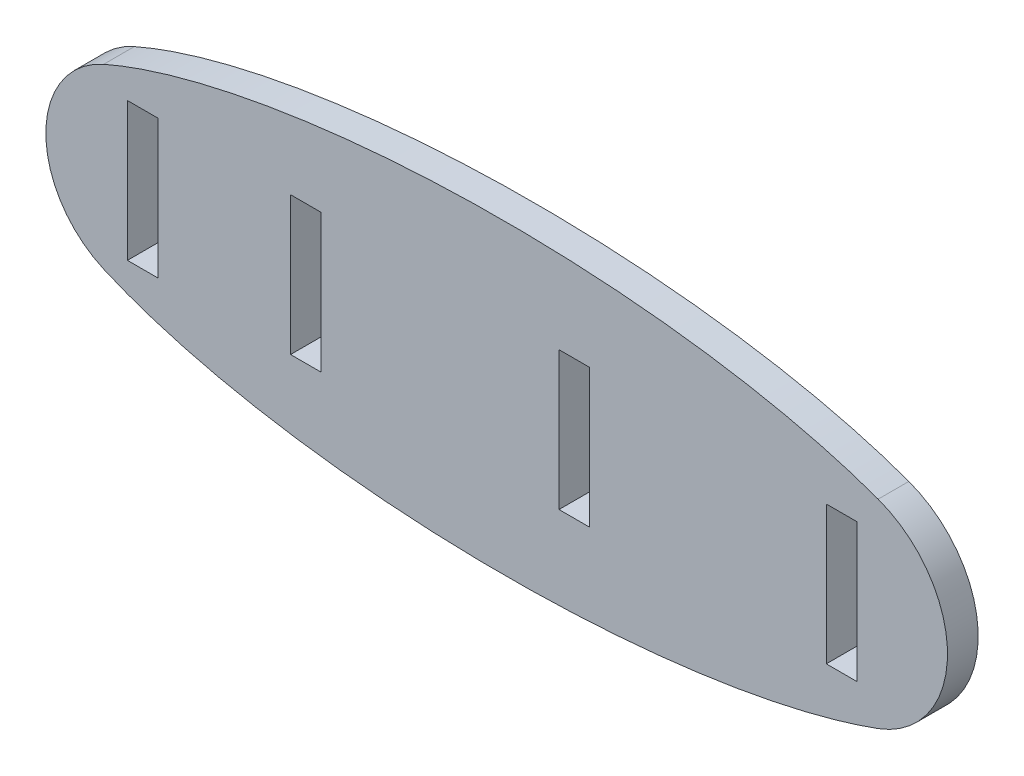
ISO-10303-21;
HEADER;
FILE_DESCRIPTION(('STEP AP214'),'2;1');
FILE_NAME('part.step','',(''),(''),'','','');
FILE_SCHEMA(('AUTOMOTIVE_DESIGN { 1 0 10303 214 1 1 1 1 }'));
ENDSEC;
DATA;
#1=APPLICATION_CONTEXT('core data for automotive mechanical design processes');
#2=APPLICATION_PROTOCOL_DEFINITION('international standard','automotive_design',2000,#1);
#3=PRODUCT_CONTEXT('',#1,'mechanical');
#4=PRODUCT('Part','Part','',(#3));
#5=PRODUCT_RELATED_PRODUCT_CATEGORY('part','',(#4));
#6=PRODUCT_DEFINITION_FORMATION('','',#4);
#7=PRODUCT_DEFINITION_CONTEXT('part definition',#1,'design');
#8=PRODUCT_DEFINITION('design','',#6,#7);
#9=PRODUCT_DEFINITION_SHAPE('','',#8);
#10=(LENGTH_UNIT() NAMED_UNIT(*) SI_UNIT(.MILLI.,.METRE.));
#11=(NAMED_UNIT(*) PLANE_ANGLE_UNIT() SI_UNIT($,.RADIAN.));
#12=(NAMED_UNIT(*) SI_UNIT($,.STERADIAN.) SOLID_ANGLE_UNIT());
#13=UNCERTAINTY_MEASURE_WITH_UNIT(LENGTH_MEASURE(1.E-05),#10,'distance_accuracy_value','');
#14=(GEOMETRIC_REPRESENTATION_CONTEXT(3) GLOBAL_UNCERTAINTY_ASSIGNED_CONTEXT((#13)) GLOBAL_UNIT_ASSIGNED_CONTEXT((#10,
#11,#12)) REPRESENTATION_CONTEXT('',''));
#15=CARTESIAN_POINT('',(0.,0.,0.));
#16=DIRECTION('',(0.,0.,1.));
#17=DIRECTION('',(1.,0.,0.));
#18=AXIS2_PLACEMENT_3D('',#15,#16,#17);
#19=CARTESIAN_POINT('',(18.25625,0.,1.5875));
#20=DIRECTION('',(-1.,0.,0.));
#21=DIRECTION('',(0.,-1.,0.));
#22=AXIS2_PLACEMENT_3D('',#19,#20,#21);
#23=PLANE('',#22);
#24=DIRECTION('',(0.,1.,0.));
#25=VECTOR('',#24,1.);
#26=CARTESIAN_POINT('',(18.25625,0.,0.));
#27=LINE('',#26,#25);
#28=CARTESIAN_POINT('',(18.25625,-3.5814,0.));
#29=VERTEX_POINT('',#28);
#30=CARTESIAN_POINT('',(18.25625,3.5814,0.));
#31=VERTEX_POINT('',#30);
#32=EDGE_CURVE('E277',#29,#31,#27,.T.);
#33=ORIENTED_EDGE('',*,*,#32,.F.);
#34=DIRECTION('',(0.,0.,-1.));
#35=VECTOR('',#34,1.);
#36=CARTESIAN_POINT('',(18.25625,-3.5814,1.5875));
#37=LINE('',#36,#35);
#38=CARTESIAN_POINT('',(18.25625,-3.5814,1.5875));
#39=VERTEX_POINT('',#38);
#40=EDGE_CURVE('E11',#39,#29,#37,.T.);
#41=ORIENTED_EDGE('',*,*,#40,.F.);
#42=DIRECTION('',(0.,1.,0.));
#43=VECTOR('',#42,1.);
#44=CARTESIAN_POINT('',(18.25625,0.,1.5875));
#45=LINE('',#44,#43);
#46=CARTESIAN_POINT('',(18.25625,3.5814,1.5875));
#47=VERTEX_POINT('',#46);
#48=EDGE_CURVE('E208',#39,#47,#45,.T.);
#49=ORIENTED_EDGE('',*,*,#48,.T.);
#50=DIRECTION('',(0.,0.,-1.));
#51=VECTOR('',#50,1.);
#52=CARTESIAN_POINT('',(18.25625,3.5814,1.5875));
#53=LINE('',#52,#51);
#54=EDGE_CURVE('E132',#47,#31,#53,.T.);
#55=ORIENTED_EDGE('',*,*,#54,.T.);
#56=EDGE_LOOP('',(#33,#41,#49,#55));
#57=FACE_BOUND('',#56,.T.);
#58=ADVANCED_FACE('F41',(#57),#23,.T.);
#59=CARTESIAN_POINT('',(0.,-3.5814,1.5875));
#60=DIRECTION('',(0.,1.,0.));
#61=DIRECTION('',(0.,0.,1.));
#62=AXIS2_PLACEMENT_3D('',#59,#60,#61);
#63=PLANE('',#62);
#64=DIRECTION('',(1.,0.,0.));
#65=VECTOR('',#64,1.);
#66=CARTESIAN_POINT('',(0.,-3.5814,0.));
#67=LINE('',#66,#65);
#68=CARTESIAN_POINT('',(16.66875,-3.5814,0.));
#69=VERTEX_POINT('',#68);
#70=EDGE_CURVE('E196',#69,#29,#67,.T.);
#71=ORIENTED_EDGE('',*,*,#70,.F.);
#72=DIRECTION('',(0.,0.,-1.));
#73=VECTOR('',#72,1.);
#74=CARTESIAN_POINT('',(16.66875,-3.5814,1.5875));
#75=LINE('',#74,#73);
#76=CARTESIAN_POINT('',(16.66875,-3.5814,1.5875));
#77=VERTEX_POINT('',#76);
#78=EDGE_CURVE('E52',#77,#69,#75,.T.);
#79=ORIENTED_EDGE('',*,*,#78,.F.);
#80=DIRECTION('',(1.,0.,0.));
#81=VECTOR('',#80,1.);
#82=CARTESIAN_POINT('',(0.,-3.5814,1.5875));
#83=LINE('',#82,#81);
#84=EDGE_CURVE('E194',#77,#39,#83,.T.);
#85=ORIENTED_EDGE('',*,*,#84,.T.);
#86=ORIENTED_EDGE('',*,*,#40,.T.);
#87=EDGE_LOOP('',(#71,#79,#85,#86));
#88=FACE_BOUND('',#87,.T.);
#89=ADVANCED_FACE('F192',(#88),#63,.T.);
#90=CARTESIAN_POINT('',(16.66875,0.,1.5875));
#91=DIRECTION('',(-1.,0.,0.));
#92=DIRECTION('',(0.,0.,1.));
#93=AXIS2_PLACEMENT_3D('',#90,#91,#92);
#94=PLANE('',#93);
#95=DIRECTION('',(0.,1.,0.));
#96=VECTOR('',#95,1.);
#97=CARTESIAN_POINT('',(16.66875,0.,0.));
#98=LINE('',#97,#96);
#99=CARTESIAN_POINT('',(16.66875,3.5814,0.));
#100=VERTEX_POINT('',#99);
#101=EDGE_CURVE('E282',#69,#100,#98,.T.);
#102=ORIENTED_EDGE('',*,*,#101,.T.);
#103=DIRECTION('',(0.,0.,-1.));
#104=VECTOR('',#103,1.);
#105=CARTESIAN_POINT('',(16.66875,3.5814,1.5875));
#106=LINE('',#105,#104);
#107=CARTESIAN_POINT('',(16.66875,3.5814,1.5875));
#108=VERTEX_POINT('',#107);
#109=EDGE_CURVE('E200',#108,#100,#106,.T.);
#110=ORIENTED_EDGE('',*,*,#109,.F.);
#111=DIRECTION('',(0.,1.,0.));
#112=VECTOR('',#111,1.);
#113=CARTESIAN_POINT('',(16.66875,0.,1.5875));
#114=LINE('',#113,#112);
#115=EDGE_CURVE('E203',#77,#108,#114,.T.);
#116=ORIENTED_EDGE('',*,*,#115,.F.);
#117=ORIENTED_EDGE('',*,*,#78,.T.);
#118=EDGE_LOOP('',(#102,#110,#116,#117));
#119=FACE_BOUND('',#118,.T.);
#120=ADVANCED_FACE('F204',(#119),#94,.F.);
#121=CARTESIAN_POINT('',(-17.905335792,0.,1.5875));
#122=DIRECTION('',(-1.,0.,0.));
#123=DIRECTION('',(0.,-1.,0.));
#124=AXIS2_PLACEMENT_3D('',#121,#122,#123);
#125=PLANE('',#124);
#126=DIRECTION('',(0.,1.,0.));
#127=VECTOR('',#126,1.);
#128=CARTESIAN_POINT('',(-17.905335792,0.,0.));
#129=LINE('',#128,#127);
#130=CARTESIAN_POINT('',(-17.905335792,-3.58140000000001,0.));
#131=VERTEX_POINT('',#130);
#132=CARTESIAN_POINT('',(-17.905335792,3.58139999999999,0.));
#133=VERTEX_POINT('',#132);
#134=EDGE_CURVE('E261',#131,#133,#129,.T.);
#135=ORIENTED_EDGE('',*,*,#134,.F.);
#136=DIRECTION('',(0.,0.,-1.));
#137=VECTOR('',#136,1.);
#138=CARTESIAN_POINT('',(-17.905335792,-3.58140000000001,1.5875));
#139=LINE('',#138,#137);
#140=CARTESIAN_POINT('',(-17.905335792,-3.58140000000001,1.5875));
#141=VERTEX_POINT('',#140);
#142=EDGE_CURVE('E290',#141,#131,#139,.T.);
#143=ORIENTED_EDGE('',*,*,#142,.F.);
#144=DIRECTION('',(0.,1.,0.));
#145=VECTOR('',#144,1.);
#146=CARTESIAN_POINT('',(-17.905335792,0.,1.5875));
#147=LINE('',#146,#145);
#148=CARTESIAN_POINT('',(-17.905335792,3.58139999999999,1.5875));
#149=VERTEX_POINT('',#148);
#150=EDGE_CURVE('E470',#141,#149,#147,.T.);
#151=ORIENTED_EDGE('',*,*,#150,.T.);
#152=DIRECTION('',(0.,0.,-1.));
#153=VECTOR('',#152,1.);
#154=CARTESIAN_POINT('',(-17.905335792,3.58139999999999,1.5875));
#155=LINE('',#154,#153);
#156=EDGE_CURVE('E293',#149,#133,#155,.T.);
#157=ORIENTED_EDGE('',*,*,#156,.T.);
#158=EDGE_LOOP('',(#135,#143,#151,#157));
#159=FACE_BOUND('',#158,.T.);
#160=ADVANCED_FACE('F448',(#159),#125,.T.);
#161=CARTESIAN_POINT('',(0.,-3.5814,1.5875));
#162=DIRECTION('',(0.,1.,0.));
#163=DIRECTION('',(-1.,0.,0.));
#164=AXIS2_PLACEMENT_3D('',#161,#162,#163);
#165=PLANE('',#164);
#166=DIRECTION('',(1.,0.,0.));
#167=VECTOR('',#166,1.);
#168=CARTESIAN_POINT('',(0.,-3.5814,0.));
#169=LINE('',#168,#167);
#170=CARTESIAN_POINT('',(-19.492835792,-3.58140000000001,0.));
#171=VERTEX_POINT('',#170);
#172=EDGE_CURVE('E265',#171,#131,#169,.T.);
#173=ORIENTED_EDGE('',*,*,#172,.F.);
#174=DIRECTION('',(0.,0.,-1.));
#175=VECTOR('',#174,1.);
#176=CARTESIAN_POINT('',(-19.492835792,-3.58140000000001,1.5875));
#177=LINE('',#176,#175);
#178=CARTESIAN_POINT('',(-19.492835792,-3.58140000000001,1.5875));
#179=VERTEX_POINT('',#178);
#180=EDGE_CURVE('E301',#179,#171,#177,.T.);
#181=ORIENTED_EDGE('',*,*,#180,.F.);
#182=DIRECTION('',(1.,0.,0.));
#183=VECTOR('',#182,1.);
#184=CARTESIAN_POINT('',(0.,-3.5814,1.5875));
#185=LINE('',#184,#183);
#186=EDGE_CURVE('E465',#179,#141,#185,.T.);
#187=ORIENTED_EDGE('',*,*,#186,.T.);
#188=ORIENTED_EDGE('',*,*,#142,.T.);
#189=EDGE_LOOP('',(#173,#181,#187,#188));
#190=FACE_BOUND('',#189,.T.);
#191=ADVANCED_FACE('F445',(#190),#165,.T.);
#192=CARTESIAN_POINT('',(-19.492835792,0.,1.5875));
#193=DIRECTION('',(-1.,0.,0.));
#194=DIRECTION('',(0.,0.,1.));
#195=AXIS2_PLACEMENT_3D('',#192,#193,#194);
#196=PLANE('',#195);
#197=DIRECTION('',(0.,1.,0.));
#198=VECTOR('',#197,1.);
#199=CARTESIAN_POINT('',(-19.492835792,0.,0.));
#200=LINE('',#199,#198);
#201=CARTESIAN_POINT('',(-19.492835792,3.58139999999999,0.));
#202=VERTEX_POINT('',#201);
#203=EDGE_CURVE('E269',#171,#202,#200,.T.);
#204=ORIENTED_EDGE('',*,*,#203,.T.);
#205=DIRECTION('',(0.,0.,-1.));
#206=VECTOR('',#205,1.);
#207=CARTESIAN_POINT('',(-19.492835792,3.58139999999999,1.5875));
#208=LINE('',#207,#206);
#209=CARTESIAN_POINT('',(-19.492835792,3.58139999999999,1.5875));
#210=VERTEX_POINT('',#209);
#211=EDGE_CURVE('E296',#210,#202,#208,.T.);
#212=ORIENTED_EDGE('',*,*,#211,.F.);
#213=DIRECTION('',(0.,1.,0.));
#214=VECTOR('',#213,1.);
#215=CARTESIAN_POINT('',(-19.492835792,0.,1.5875));
#216=LINE('',#215,#214);
#217=EDGE_CURVE('E469',#179,#210,#216,.T.);
#218=ORIENTED_EDGE('',*,*,#217,.F.);
#219=ORIENTED_EDGE('',*,*,#180,.T.);
#220=EDGE_LOOP('',(#204,#212,#218,#219));
#221=FACE_BOUND('',#220,.T.);
#222=ADVANCED_FACE('F442',(#221),#196,.F.);
#223=CARTESIAN_POINT('',(0.,0.,1.5875));
#224=DIRECTION('',(0.,0.,1.));
#225=DIRECTION('',(1.,0.,0.));
#226=AXIS2_PLACEMENT_3D('',#223,#224,#225);
#227=ELLIPSE('',#226,25.4,7.9375);
#228=DIRECTION('',(0.,0.,-1.));
#229=VECTOR('',#228,1.);
#230=SURFACE_OF_LINEAR_EXTRUSION('',#227,#229);
#231=CARTESIAN_POINT('',(0.,0.,0.));
#232=DIRECTION('',(0.,0.,1.));
#233=DIRECTION('',(1.,0.,0.));
#234=AXIS2_PLACEMENT_3D('',#231,#232,#233);
#235=ELLIPSE('',#234,25.4,7.9375);
#236=CARTESIAN_POINT('',(-20.7227963755498,-4.5898762406031,0.));
#237=VERTEX_POINT('',#236);
#238=CARTESIAN_POINT('',(19.352380952381,-5.14103200776607,0.));
#239=VERTEX_POINT('',#238);
#240=EDGE_CURVE('E250',#237,#239,#235,.T.);
#241=ORIENTED_EDGE('',*,*,#240,.T.);
#242=DIRECTION('',(0.,0.,-1.));
#243=VECTOR('',#242,1.);
#244=CARTESIAN_POINT('',(19.352380952381,-5.14103200776607,1.5875));
#245=LINE('',#244,#243);
#246=CARTESIAN_POINT('',(19.352380952381,-5.14103200776607,1.5875));
#247=VERTEX_POINT('',#246);
#248=EDGE_CURVE('E297',#247,#239,#245,.T.);
#249=ORIENTED_EDGE('',*,*,#248,.F.);
#250=CARTESIAN_POINT('',(-20.7227963755498,-4.5898762406031,1.5875));
#251=VERTEX_POINT('',#250);
#252=EDGE_CURVE('E385',#251,#247,#227,.T.);
#253=ORIENTED_EDGE('',*,*,#252,.F.);
#254=DIRECTION('',(0.,0.,-1.));
#255=VECTOR('',#254,1.);
#256=CARTESIAN_POINT('',(-20.7227963755498,-4.5898762406031,1.5875));
#257=LINE('',#256,#255);
#258=EDGE_CURVE('E306',#251,#237,#257,.T.);
#259=ORIENTED_EDGE('',*,*,#258,.T.);
#260=EDGE_LOOP('',(#241,#249,#253,#259));
#261=FACE_BOUND('',#260,.T.);
#262=ADVANCED_FACE('F401',(#261),#230,.F.);
#263=CARTESIAN_POINT('',(17.4625,0.,1.5875));
#264=DIRECTION('',(0.,0.,-1.));
#265=DIRECTION('',(-1.,0.,0.));
#266=AXIS2_PLACEMENT_3D('',#263,#264,#265);
#267=CYLINDRICAL_SURFACE('',#266,5.47739537727994);
#268=CARTESIAN_POINT('',(17.4625,0.,0.));
#269=DIRECTION('',(0.,0.,1.));
#270=DIRECTION('',(1.,0.,0.));
#271=AXIS2_PLACEMENT_3D('',#268,#269,#270);
#272=CIRCLE('',#271,5.47739537727994);
#273=CARTESIAN_POINT('',(19.352380952381,5.14103200776607,0.));
#274=VERTEX_POINT('',#273);
#275=EDGE_CURVE('E254',#239,#274,#272,.T.);
#276=ORIENTED_EDGE('',*,*,#275,.T.);
#277=DIRECTION('',(0.,0.,-1.));
#278=VECTOR('',#277,1.);
#279=CARTESIAN_POINT('',(19.352380952381,5.14103200776607,1.5875));
#280=LINE('',#279,#278);
#281=CARTESIAN_POINT('',(19.352380952381,5.14103200776607,1.5875));
#282=VERTEX_POINT('',#281);
#283=EDGE_CURVE('E315',#282,#274,#280,.T.);
#284=ORIENTED_EDGE('',*,*,#283,.F.);
#285=CARTESIAN_POINT('',(17.4625,0.,1.5875));
#286=DIRECTION('',(0.,0.,1.));
#287=DIRECTION('',(1.,0.,0.));
#288=AXIS2_PLACEMENT_3D('',#285,#286,#287);
#289=CIRCLE('',#288,5.47739537727994);
#290=EDGE_CURVE('E390',#247,#282,#289,.T.);
#291=ORIENTED_EDGE('',*,*,#290,.F.);
#292=ORIENTED_EDGE('',*,*,#248,.T.);
#293=EDGE_LOOP('',(#276,#284,#291,#292));
#294=FACE_BOUND('',#293,.T.);
#295=ADVANCED_FACE('F399',(#294),#267,.T.);
#296=CARTESIAN_POINT('',(-20.7227963755498,4.5898762406031,0.));
#297=VERTEX_POINT('',#296);
#298=EDGE_CURVE('E255',#274,#297,#235,.T.);
#299=ORIENTED_EDGE('',*,*,#298,.T.);
#300=DIRECTION('',(0.,0.,-1.));
#301=VECTOR('',#300,1.);
#302=CARTESIAN_POINT('',(-20.7227963755498,4.5898762406031,1.5875));
#303=LINE('',#302,#301);
#304=CARTESIAN_POINT('',(-20.7227963755498,4.5898762406031,1.5875));
#305=VERTEX_POINT('',#304);
#306=EDGE_CURVE('E310',#305,#297,#303,.T.);
#307=ORIENTED_EDGE('',*,*,#306,.F.);
#308=EDGE_CURVE('E391',#282,#305,#227,.T.);
#309=ORIENTED_EDGE('',*,*,#308,.F.);
#310=ORIENTED_EDGE('',*,*,#283,.T.);
#311=EDGE_LOOP('',(#299,#307,#309,#310));
#312=FACE_BOUND('',#311,.T.);
#313=ADVANCED_FACE('F394',(#312),#230,.F.);
#314=CARTESIAN_POINT('',(4.425855004,0.,1.5875));
#315=DIRECTION('',(-1.,0.,0.));
#316=DIRECTION('',(0.,-1.,0.));
#317=AXIS2_PLACEMENT_3D('',#314,#315,#316);
#318=PLANE('',#317);
#319=DIRECTION('',(0.,1.,0.));
#320=VECTOR('',#319,1.);
#321=CARTESIAN_POINT('',(4.425855004,0.,0.));
#322=LINE('',#321,#320);
#323=CARTESIAN_POINT('',(4.425855004,-3.5814,0.));
#324=VERTEX_POINT('',#323);
#325=CARTESIAN_POINT('',(4.425855004,3.5814,0.));
#326=VERTEX_POINT('',#325);
#327=EDGE_CURVE('E234',#324,#326,#322,.T.);
#328=ORIENTED_EDGE('',*,*,#327,.F.);
#329=DIRECTION('',(0.,0.,-1.));
#330=VECTOR('',#329,1.);
#331=CARTESIAN_POINT('',(4.425855004,-3.5814,1.5875));
#332=LINE('',#331,#330);
#333=CARTESIAN_POINT('',(4.425855004,-3.5814,1.5875));
#334=VERTEX_POINT('',#333);
#335=EDGE_CURVE('E311',#334,#324,#332,.T.);
#336=ORIENTED_EDGE('',*,*,#335,.F.);
#337=DIRECTION('',(0.,1.,0.));
#338=VECTOR('',#337,1.);
#339=CARTESIAN_POINT('',(4.425855004,0.,1.5875));
#340=LINE('',#339,#338);
#341=CARTESIAN_POINT('',(4.425855004,3.5814,1.5875));
#342=VERTEX_POINT('',#341);
#343=EDGE_CURVE('E364',#334,#342,#340,.T.);
#344=ORIENTED_EDGE('',*,*,#343,.T.);
#345=DIRECTION('',(0.,0.,-1.));
#346=VECTOR('',#345,1.);
#347=CARTESIAN_POINT('',(4.425855004,3.5814,1.5875));
#348=LINE('',#347,#346);
#349=EDGE_CURVE('E322',#342,#326,#348,.T.);
#350=ORIENTED_EDGE('',*,*,#349,.T.);
#351=EDGE_LOOP('',(#328,#336,#344,#350));
#352=FACE_BOUND('',#351,.T.);
#353=ADVANCED_FACE('F398',(#352),#318,.T.);
#354=CARTESIAN_POINT('',(0.,-3.5814,1.5875));
#355=DIRECTION('',(0.,1.,0.));
#356=DIRECTION('',(-1.,0.,0.));
#357=AXIS2_PLACEMENT_3D('',#354,#355,#356);
#358=PLANE('',#357);
#359=DIRECTION('',(1.,0.,0.));
#360=VECTOR('',#359,1.);
#361=CARTESIAN_POINT('',(0.,-3.5814,0.));
#362=LINE('',#361,#360);
#363=CARTESIAN_POINT('',(2.838355004,-3.5814,0.));
#364=VERTEX_POINT('',#363);
#365=EDGE_CURVE('E238',#364,#324,#362,.T.);
#366=ORIENTED_EDGE('',*,*,#365,.F.);
#367=DIRECTION('',(0.,0.,-1.));
#368=VECTOR('',#367,1.);
#369=CARTESIAN_POINT('',(2.838355004,-3.5814,1.5875));
#370=LINE('',#369,#368);
#371=CARTESIAN_POINT('',(2.838355004,-3.5814,1.5875));
#372=VERTEX_POINT('',#371);
#373=EDGE_CURVE('E329',#372,#364,#370,.T.);
#374=ORIENTED_EDGE('',*,*,#373,.F.);
#375=DIRECTION('',(1.,0.,0.));
#376=VECTOR('',#375,1.);
#377=CARTESIAN_POINT('',(0.,-3.5814,1.5875));
#378=LINE('',#377,#376);
#379=EDGE_CURVE('E370',#372,#334,#378,.T.);
#380=ORIENTED_EDGE('',*,*,#379,.T.);
#381=ORIENTED_EDGE('',*,*,#335,.T.);
#382=EDGE_LOOP('',(#366,#374,#380,#381));
#383=FACE_BOUND('',#382,.T.);
#384=ADVANCED_FACE('F414',(#383),#358,.T.);
#385=CARTESIAN_POINT('',(2.838355004,0.,1.5875));
#386=DIRECTION('',(-1.,0.,0.));
#387=DIRECTION('',(0.,-1.,0.));
#388=AXIS2_PLACEMENT_3D('',#385,#386,#387);
#389=PLANE('',#388);
#390=DIRECTION('',(0.,1.,0.));
#391=VECTOR('',#390,1.);
#392=CARTESIAN_POINT('',(2.838355004,0.,0.));
#393=LINE('',#392,#391);
#394=CARTESIAN_POINT('',(2.838355004,3.5814,0.));
#395=VERTEX_POINT('',#394);
#396=EDGE_CURVE('E242',#364,#395,#393,.T.);
#397=ORIENTED_EDGE('',*,*,#396,.T.);
#398=DIRECTION('',(0.,0.,-1.));
#399=VECTOR('',#398,1.);
#400=CARTESIAN_POINT('',(2.838355004,3.5814,1.5875));
#401=LINE('',#400,#399);
#402=CARTESIAN_POINT('',(2.838355004,3.5814,1.5875));
#403=VERTEX_POINT('',#402);
#404=EDGE_CURVE('E325',#403,#395,#401,.T.);
#405=ORIENTED_EDGE('',*,*,#404,.F.);
#406=DIRECTION('',(0.,1.,0.));
#407=VECTOR('',#406,1.);
#408=CARTESIAN_POINT('',(2.838355004,0.,1.5875));
#409=LINE('',#408,#407);
#410=EDGE_CURVE('E378',#372,#403,#409,.T.);
#411=ORIENTED_EDGE('',*,*,#410,.F.);
#412=ORIENTED_EDGE('',*,*,#373,.T.);
#413=EDGE_LOOP('',(#397,#405,#411,#412));
#414=FACE_BOUND('',#413,.T.);
#415=ADVANCED_FACE('F411',(#414),#389,.F.);
#416=CARTESIAN_POINT('',(-9.464908934,0.,1.5875));
#417=DIRECTION('',(-1.,0.,0.));
#418=DIRECTION('',(0.,-1.,0.));
#419=AXIS2_PLACEMENT_3D('',#416,#417,#418);
#420=PLANE('',#419);
#421=DIRECTION('',(0.,1.,0.));
#422=VECTOR('',#421,1.);
#423=CARTESIAN_POINT('',(-9.464908934,0.,0.));
#424=LINE('',#423,#422);
#425=CARTESIAN_POINT('',(-9.464908934,-3.5814,0.));
#426=VERTEX_POINT('',#425);
#427=CARTESIAN_POINT('',(-9.464908934,3.5814,0.));
#428=VERTEX_POINT('',#427);
#429=EDGE_CURVE('E219',#426,#428,#424,.T.);
#430=ORIENTED_EDGE('',*,*,#429,.F.);
#431=DIRECTION('',(0.,0.,-1.));
#432=VECTOR('',#431,1.);
#433=CARTESIAN_POINT('',(-9.464908934,-3.5814,1.5875));
#434=LINE('',#433,#432);
#435=CARTESIAN_POINT('',(-9.464908934,-3.5814,1.5875));
#436=VERTEX_POINT('',#435);
#437=EDGE_CURVE('E45',#436,#426,#434,.T.);
#438=ORIENTED_EDGE('',*,*,#437,.F.);
#439=DIRECTION('',(0.,1.,0.));
#440=VECTOR('',#439,1.);
#441=CARTESIAN_POINT('',(-9.464908934,0.,1.5875));
#442=LINE('',#441,#440);
#443=CARTESIAN_POINT('',(-9.464908934,3.5814,1.5875));
#444=VERTEX_POINT('',#443);
#445=EDGE_CURVE('E287',#436,#444,#442,.T.);
#446=ORIENTED_EDGE('',*,*,#445,.T.);
#447=DIRECTION('',(0.,0.,-1.));
#448=VECTOR('',#447,1.);
#449=CARTESIAN_POINT('',(-9.464908934,3.5814,1.5875));
#450=LINE('',#449,#448);
#451=EDGE_CURVE('E218',#444,#428,#450,.T.);
#452=ORIENTED_EDGE('',*,*,#451,.T.);
#453=EDGE_LOOP('',(#430,#438,#446,#452));
#454=FACE_BOUND('',#453,.T.);
#455=ADVANCED_FACE('F43',(#454),#420,.T.);
#456=CARTESIAN_POINT('',(0.,-3.5814,1.5875));
#457=DIRECTION('',(0.,1.,0.));
#458=DIRECTION('',(-1.,0.,0.));
#459=AXIS2_PLACEMENT_3D('',#456,#457,#458);
#460=PLANE('',#459);
#461=DIRECTION('',(1.,0.,0.));
#462=VECTOR('',#461,1.);
#463=CARTESIAN_POINT('',(0.,-3.5814,0.));
#464=LINE('',#463,#462);
#465=CARTESIAN_POINT('',(-11.052408934,-3.5814,0.));
#466=VERTEX_POINT('',#465);
#467=EDGE_CURVE('E223',#466,#426,#464,.T.);
#468=ORIENTED_EDGE('',*,*,#467,.F.);
#469=DIRECTION('',(0.,0.,-1.));
#470=VECTOR('',#469,1.);
#471=CARTESIAN_POINT('',(-11.052408934,-3.5814,1.5875));
#472=LINE('',#471,#470);
#473=CARTESIAN_POINT('',(-11.052408934,-3.5814,1.5875));
#474=VERTEX_POINT('',#473);
#475=EDGE_CURVE('E339',#474,#466,#472,.T.);
#476=ORIENTED_EDGE('',*,*,#475,.F.);
#477=DIRECTION('',(1.,0.,0.));
#478=VECTOR('',#477,1.);
#479=CARTESIAN_POINT('',(0.,-3.5814,1.5875));
#480=LINE('',#479,#478);
#481=EDGE_CURVE('E350',#474,#436,#480,.T.);
#482=ORIENTED_EDGE('',*,*,#481,.T.);
#483=ORIENTED_EDGE('',*,*,#437,.T.);
#484=EDGE_LOOP('',(#468,#476,#482,#483));
#485=FACE_BOUND('',#484,.T.);
#486=ADVANCED_FACE('F348',(#485),#460,.T.);
#487=CARTESIAN_POINT('',(-11.052408934,0.,1.5875));
#488=DIRECTION('',(-1.,0.,0.));
#489=DIRECTION('',(0.,0.,1.));
#490=AXIS2_PLACEMENT_3D('',#487,#488,#489);
#491=PLANE('',#490);
#492=DIRECTION('',(0.,1.,0.));
#493=VECTOR('',#492,1.);
#494=CARTESIAN_POINT('',(-11.052408934,0.,0.));
#495=LINE('',#494,#493);
#496=CARTESIAN_POINT('',(-11.052408934,3.5814,0.));
#497=VERTEX_POINT('',#496);
#498=EDGE_CURVE('E227',#466,#497,#495,.T.);
#499=ORIENTED_EDGE('',*,*,#498,.T.);
#500=DIRECTION('',(0.,0.,-1.));
#501=VECTOR('',#500,1.);
#502=CARTESIAN_POINT('',(-11.052408934,3.5814,1.5875));
#503=LINE('',#502,#501);
#504=CARTESIAN_POINT('',(-11.052408934,3.5814,1.5875));
#505=VERTEX_POINT('',#504);
#506=EDGE_CURVE('E336',#505,#497,#503,.T.);
#507=ORIENTED_EDGE('',*,*,#506,.F.);
#508=DIRECTION('',(0.,1.,0.));
#509=VECTOR('',#508,1.);
#510=CARTESIAN_POINT('',(-11.052408934,0.,1.5875));
#511=LINE('',#510,#509);
#512=EDGE_CURVE('E365',#474,#505,#511,.T.);
#513=ORIENTED_EDGE('',*,*,#512,.F.);
#514=ORIENTED_EDGE('',*,*,#475,.T.);
#515=EDGE_LOOP('',(#499,#507,#513,#514));
#516=FACE_BOUND('',#515,.T.);
#517=ADVANCED_FACE('F357',(#516),#491,.F.);
#518=CARTESIAN_POINT('',(0.,3.5814,1.5875));
#519=DIRECTION('',(0.,1.,0.));
#520=DIRECTION('',(-1.,0.,0.));
#521=AXIS2_PLACEMENT_3D('',#518,#519,#520);
#522=PLANE('',#521);
#523=DIRECTION('',(1.,0.,0.));
#524=VECTOR('',#523,1.);
#525=CARTESIAN_POINT('',(0.,3.5814,0.));
#526=LINE('',#525,#524);
#527=EDGE_CURVE('E273',#202,#133,#526,.T.);
#528=ORIENTED_EDGE('',*,*,#527,.T.);
#529=ORIENTED_EDGE('',*,*,#156,.F.);
#530=DIRECTION('',(1.,0.,0.));
#531=VECTOR('',#530,1.);
#532=CARTESIAN_POINT('',(0.,3.5814,1.5875));
#533=LINE('',#532,#531);
#534=EDGE_CURVE('E212',#210,#149,#533,.T.);
#535=ORIENTED_EDGE('',*,*,#534,.F.);
#536=ORIENTED_EDGE('',*,*,#211,.T.);
#537=EDGE_LOOP('',(#528,#529,#535,#536));
#538=FACE_BOUND('',#537,.T.);
#539=ADVANCED_FACE('F426',(#538),#522,.F.);
#540=CARTESIAN_POINT('',(-18.699085792,0.,1.5875));
#541=DIRECTION('',(0.,0.,-1.));
#542=DIRECTION('',(-1.,0.,0.));
#543=AXIS2_PLACEMENT_3D('',#540,#541,#542);
#544=CYLINDRICAL_SURFACE('',#543,5.01621056476143);
#545=CARTESIAN_POINT('',(-18.699085792,0.,0.));
#546=DIRECTION('',(0.,0.,1.));
#547=DIRECTION('',(1.,0.,0.));
#548=AXIS2_PLACEMENT_3D('',#545,#546,#547);
#549=CIRCLE('',#548,5.01621056476143);
#550=EDGE_CURVE('E258',#297,#237,#549,.T.);
#551=ORIENTED_EDGE('',*,*,#550,.T.);
#552=ORIENTED_EDGE('',*,*,#258,.F.);
#553=CARTESIAN_POINT('',(-18.699085792,0.,1.5875));
#554=DIRECTION('',(0.,0.,1.));
#555=DIRECTION('',(1.,0.,0.));
#556=AXIS2_PLACEMENT_3D('',#553,#554,#555);
#557=CIRCLE('',#556,5.01621056476143);
#558=EDGE_CURVE('E475',#305,#251,#557,.T.);
#559=ORIENTED_EDGE('',*,*,#558,.F.);
#560=ORIENTED_EDGE('',*,*,#306,.T.);
#561=EDGE_LOOP('',(#551,#552,#559,#560));
#562=FACE_BOUND('',#561,.T.);
#563=ADVANCED_FACE('F402',(#562),#544,.T.);
#564=CARTESIAN_POINT('',(0.,3.5814,1.5875));
#565=DIRECTION('',(0.,1.,0.));
#566=DIRECTION('',(0.,0.,1.));
#567=AXIS2_PLACEMENT_3D('',#564,#565,#566);
#568=PLANE('',#567);
#569=DIRECTION('',(1.,0.,0.));
#570=VECTOR('',#569,1.);
#571=CARTESIAN_POINT('',(0.,3.5814,0.));
#572=LINE('',#571,#570);
#573=EDGE_CURVE('E246',#395,#326,#572,.T.);
#574=ORIENTED_EDGE('',*,*,#573,.T.);
#575=ORIENTED_EDGE('',*,*,#349,.F.);
#576=DIRECTION('',(1.,0.,0.));
#577=VECTOR('',#576,1.);
#578=CARTESIAN_POINT('',(0.,3.5814,1.5875));
#579=LINE('',#578,#577);
#580=EDGE_CURVE('E382',#403,#342,#579,.T.);
#581=ORIENTED_EDGE('',*,*,#580,.F.);
#582=ORIENTED_EDGE('',*,*,#404,.T.);
#583=EDGE_LOOP('',(#574,#575,#581,#582));
#584=FACE_BOUND('',#583,.T.);
#585=ADVANCED_FACE('F407',(#584),#568,.F.);
#586=CARTESIAN_POINT('',(0.,3.5814,1.5875));
#587=DIRECTION('',(0.,1.,0.));
#588=DIRECTION('',(0.,0.,1.));
#589=AXIS2_PLACEMENT_3D('',#586,#587,#588);
#590=PLANE('',#589);
#591=DIRECTION('',(1.,0.,0.));
#592=VECTOR('',#591,1.);
#593=CARTESIAN_POINT('',(0.,3.5814,0.));
#594=LINE('',#593,#592);
#595=EDGE_CURVE('E230',#497,#428,#594,.T.);
#596=ORIENTED_EDGE('',*,*,#595,.T.);
#597=ORIENTED_EDGE('',*,*,#451,.F.);
#598=DIRECTION('',(1.,0.,0.));
#599=VECTOR('',#598,1.);
#600=CARTESIAN_POINT('',(0.,3.5814,1.5875));
#601=LINE('',#600,#599);
#602=EDGE_CURVE('E361',#505,#444,#601,.T.);
#603=ORIENTED_EDGE('',*,*,#602,.F.);
#604=ORIENTED_EDGE('',*,*,#506,.T.);
#605=EDGE_LOOP('',(#596,#597,#603,#604));
#606=FACE_BOUND('',#605,.T.);
#607=ADVANCED_FACE('F360',(#606),#590,.F.);
#608=CARTESIAN_POINT('',(0.,3.5814,1.5875));
#609=DIRECTION('',(0.,1.,0.));
#610=DIRECTION('',(-1.,0.,0.));
#611=AXIS2_PLACEMENT_3D('',#608,#609,#610);
#612=PLANE('',#611);
#613=DIRECTION('',(1.,0.,0.));
#614=VECTOR('',#613,1.);
#615=CARTESIAN_POINT('',(0.,3.5814,0.));
#616=LINE('',#615,#614);
#617=EDGE_CURVE('E125',#100,#31,#616,.T.);
#618=ORIENTED_EDGE('',*,*,#617,.T.);
#619=ORIENTED_EDGE('',*,*,#54,.F.);
#620=DIRECTION('',(1.,0.,0.));
#621=VECTOR('',#620,1.);
#622=CARTESIAN_POINT('',(0.,3.5814,1.5875));
#623=LINE('',#622,#621);
#624=EDGE_CURVE('E61',#108,#47,#623,.T.);
#625=ORIENTED_EDGE('',*,*,#624,.F.);
#626=ORIENTED_EDGE('',*,*,#109,.T.);
#627=EDGE_LOOP('',(#618,#619,#625,#626));
#628=FACE_BOUND('',#627,.T.);
#629=ADVANCED_FACE('F424',(#628),#612,.F.);
#630=CARTESIAN_POINT('',(0.,0.,1.5875));
#631=DIRECTION('',(0.,0.,1.));
#632=DIRECTION('',(1.,0.,0.));
#633=AXIS2_PLACEMENT_3D('',#630,#631,#632);
#634=PLANE('',#633);
#635=ORIENTED_EDGE('',*,*,#445,.F.);
#636=ORIENTED_EDGE('',*,*,#481,.F.);
#637=ORIENTED_EDGE('',*,*,#512,.T.);
#638=ORIENTED_EDGE('',*,*,#602,.T.);
#639=EDGE_LOOP('',(#635,#636,#637,#638));
#640=FACE_BOUND('',#639,.T.);
#641=ORIENTED_EDGE('',*,*,#343,.F.);
#642=ORIENTED_EDGE('',*,*,#379,.F.);
#643=ORIENTED_EDGE('',*,*,#410,.T.);
#644=ORIENTED_EDGE('',*,*,#580,.T.);
#645=EDGE_LOOP('',(#641,#642,#643,#644));
#646=FACE_BOUND('',#645,.T.);
#647=ORIENTED_EDGE('',*,*,#252,.T.);
#648=ORIENTED_EDGE('',*,*,#290,.T.);
#649=ORIENTED_EDGE('',*,*,#308,.T.);
#650=ORIENTED_EDGE('',*,*,#558,.T.);
#651=EDGE_LOOP('',(#647,#648,#649,#650));
#652=FACE_BOUND('',#651,.T.);
#653=ORIENTED_EDGE('',*,*,#150,.F.);
#654=ORIENTED_EDGE('',*,*,#186,.F.);
#655=ORIENTED_EDGE('',*,*,#217,.T.);
#656=ORIENTED_EDGE('',*,*,#534,.T.);
#657=EDGE_LOOP('',(#653,#654,#655,#656));
#658=FACE_BOUND('',#657,.T.);
#659=ORIENTED_EDGE('',*,*,#48,.F.);
#660=ORIENTED_EDGE('',*,*,#84,.F.);
#661=ORIENTED_EDGE('',*,*,#115,.T.);
#662=ORIENTED_EDGE('',*,*,#624,.T.);
#663=EDGE_LOOP('',(#659,#660,#661,#662));
#664=FACE_BOUND('',#663,.T.);
#665=ADVANCED_FACE('F207',(#640,#646,#652,#658,#664),#634,.T.);
#666=CARTESIAN_POINT('',(0.,0.,0.));
#667=DIRECTION('',(0.,0.,1.));
#668=DIRECTION('',(1.,0.,0.));
#669=AXIS2_PLACEMENT_3D('',#666,#667,#668);
#670=PLANE('',#669);
#671=ORIENTED_EDGE('',*,*,#429,.T.);
#672=ORIENTED_EDGE('',*,*,#595,.F.);
#673=ORIENTED_EDGE('',*,*,#498,.F.);
#674=ORIENTED_EDGE('',*,*,#467,.T.);
#675=EDGE_LOOP('',(#671,#672,#673,#674));
#676=FACE_BOUND('',#675,.T.);
#677=ORIENTED_EDGE('',*,*,#327,.T.);
#678=ORIENTED_EDGE('',*,*,#573,.F.);
#679=ORIENTED_EDGE('',*,*,#396,.F.);
#680=ORIENTED_EDGE('',*,*,#365,.T.);
#681=EDGE_LOOP('',(#677,#678,#679,#680));
#682=FACE_BOUND('',#681,.T.);
#683=ORIENTED_EDGE('',*,*,#240,.F.);
#684=ORIENTED_EDGE('',*,*,#550,.F.);
#685=ORIENTED_EDGE('',*,*,#298,.F.);
#686=ORIENTED_EDGE('',*,*,#275,.F.);
#687=EDGE_LOOP('',(#683,#684,#685,#686));
#688=FACE_BOUND('',#687,.T.);
#689=ORIENTED_EDGE('',*,*,#134,.T.);
#690=ORIENTED_EDGE('',*,*,#527,.F.);
#691=ORIENTED_EDGE('',*,*,#203,.F.);
#692=ORIENTED_EDGE('',*,*,#172,.T.);
#693=EDGE_LOOP('',(#689,#690,#691,#692));
#694=FACE_BOUND('',#693,.T.);
#695=ORIENTED_EDGE('',*,*,#32,.T.);
#696=ORIENTED_EDGE('',*,*,#617,.F.);
#697=ORIENTED_EDGE('',*,*,#101,.F.);
#698=ORIENTED_EDGE('',*,*,#70,.T.);
#699=EDGE_LOOP('',(#695,#696,#697,#698));
#700=FACE_BOUND('',#699,.T.);
#701=ADVANCED_FACE('F354',(#676,#682,#688,#694,#700),#670,.F.);
#702=CLOSED_SHELL('',(#58,#89,#120,#160,#191,#222,#262,#295,#313,#353,#384,#415,#455,#486,#517,
#539,#563,#585,#607,#629,#665,#701));
#703=MANIFOLD_SOLID_BREP('B2',#702);
#704=ADVANCED_BREP_SHAPE_REPRESENTATION('',(#18,#703),#14);
#705=SHAPE_DEFINITION_REPRESENTATION(#9,#704);
ENDSEC;
END-ISO-10303-21;
